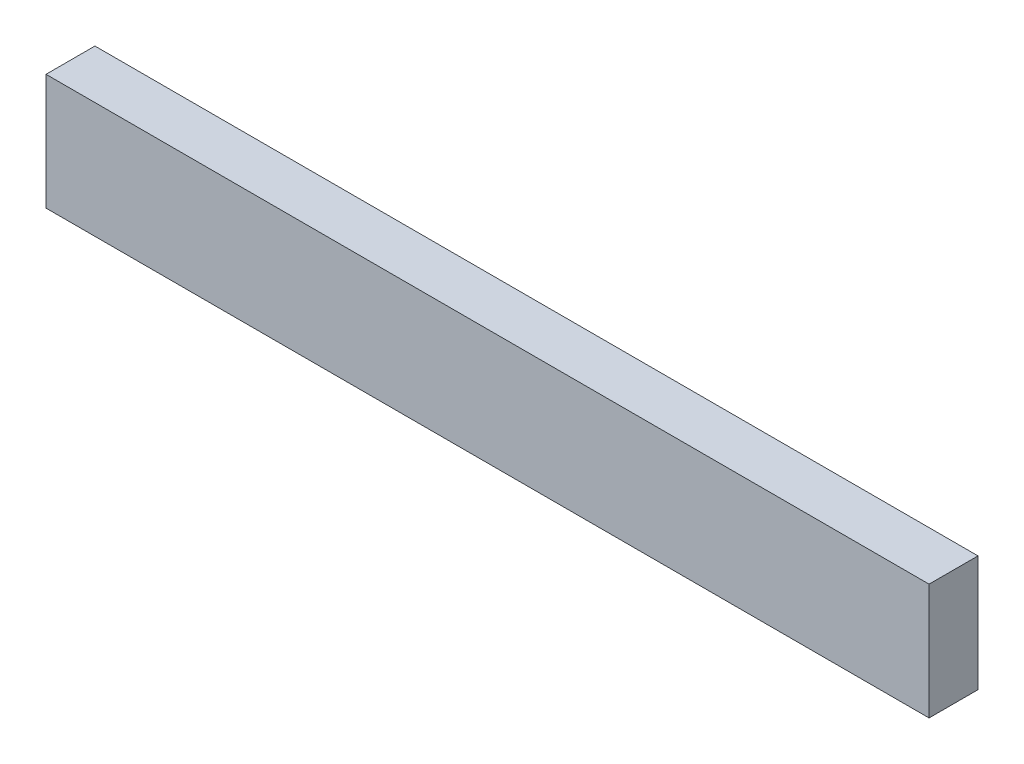
ISO-10303-21;
HEADER;
FILE_DESCRIPTION(('STEP AP214'),'2;1');
FILE_NAME('part.step','',(''),(''),'','','');
FILE_SCHEMA(('AUTOMOTIVE_DESIGN { 1 0 10303 214 1 1 1 1 }'));
ENDSEC;
DATA;
#1=APPLICATION_CONTEXT('core data for automotive mechanical design processes');
#2=APPLICATION_PROTOCOL_DEFINITION('international standard','automotive_design',2000,#1);
#3=PRODUCT_CONTEXT('',#1,'mechanical');
#4=PRODUCT('Part','Part','',(#3));
#5=PRODUCT_RELATED_PRODUCT_CATEGORY('part','',(#4));
#6=PRODUCT_DEFINITION_FORMATION('','',#4);
#7=PRODUCT_DEFINITION_CONTEXT('part definition',#1,'design');
#8=PRODUCT_DEFINITION('design','',#6,#7);
#9=PRODUCT_DEFINITION_SHAPE('','',#8);
#10=(LENGTH_UNIT() NAMED_UNIT(*) SI_UNIT(.MILLI.,.METRE.));
#11=(NAMED_UNIT(*) PLANE_ANGLE_UNIT() SI_UNIT($,.RADIAN.));
#12=(NAMED_UNIT(*) SI_UNIT($,.STERADIAN.) SOLID_ANGLE_UNIT());
#13=UNCERTAINTY_MEASURE_WITH_UNIT(LENGTH_MEASURE(1.E-05),#10,'distance_accuracy_value','');
#14=(GEOMETRIC_REPRESENTATION_CONTEXT(3) GLOBAL_UNCERTAINTY_ASSIGNED_CONTEXT((#13)) GLOBAL_UNIT_ASSIGNED_CONTEXT((#10,
#11,#12)) REPRESENTATION_CONTEXT('',''));
#15=CARTESIAN_POINT('',(0.,0.,0.));
#16=DIRECTION('',(0.,0.,1.));
#17=DIRECTION('',(1.,0.,0.));
#18=AXIS2_PLACEMENT_3D('',#15,#16,#17);
#19=CARTESIAN_POINT('',(0.,45.,-9.5));
#20=DIRECTION('',(1.,0.,0.));
#21=DIRECTION('',(0.,0.,-1.));
#22=AXIS2_PLACEMENT_3D('',#19,#20,#21);
#23=PLANE('',#22);
#24=DIRECTION('',(0.,0.,1.));
#25=VECTOR('',#24,1.);
#26=CARTESIAN_POINT('',(0.,0.,-9.5));
#27=LINE('',#26,#25);
#28=CARTESIAN_POINT('',(0.,0.,-9.5));
#29=VERTEX_POINT('',#28);
#30=CARTESIAN_POINT('',(0.,0.,9.5));
#31=VERTEX_POINT('',#30);
#32=EDGE_CURVE('E96',#29,#31,#27,.T.);
#33=ORIENTED_EDGE('',*,*,#32,.T.);
#34=DIRECTION('',(0.,-1.,0.));
#35=VECTOR('',#34,1.);
#36=CARTESIAN_POINT('',(0.,45.,9.5));
#37=LINE('',#36,#35);
#38=CARTESIAN_POINT('',(0.,45.,9.5));
#39=VERTEX_POINT('',#38);
#40=EDGE_CURVE('E11',#39,#31,#37,.T.);
#41=ORIENTED_EDGE('',*,*,#40,.F.);
#42=DIRECTION('',(0.,0.,1.));
#43=VECTOR('',#42,1.);
#44=CARTESIAN_POINT('',(0.,45.,-9.5));
#45=LINE('',#44,#43);
#46=CARTESIAN_POINT('',(0.,45.,-9.5));
#47=VERTEX_POINT('',#46);
#48=EDGE_CURVE('E84',#47,#39,#45,.T.);
#49=ORIENTED_EDGE('',*,*,#48,.F.);
#50=DIRECTION('',(0.,-1.,0.));
#51=VECTOR('',#50,1.);
#52=CARTESIAN_POINT('',(0.,45.,-9.5));
#53=LINE('',#52,#51);
#54=EDGE_CURVE('E92',#47,#29,#53,.T.);
#55=ORIENTED_EDGE('',*,*,#54,.T.);
#56=EDGE_LOOP('',(#33,#41,#49,#55));
#57=FACE_BOUND('',#56,.T.);
#58=ADVANCED_FACE('F33',(#57),#23,.F.);
#59=CARTESIAN_POINT('',(342.850000000001,45.,9.49999999999996));
#60=DIRECTION('',(0.,0.,-1.));
#61=DIRECTION('',(-1.,0.,0.));
#62=AXIS2_PLACEMENT_3D('',#59,#60,#61);
#63=PLANE('',#62);
#64=DIRECTION('',(1.,0.,0.));
#65=VECTOR('',#64,1.);
#66=CARTESIAN_POINT('',(342.850000000001,0.,9.49999999999996));
#67=LINE('',#66,#65);
#68=CARTESIAN_POINT('',(342.850000000001,0.,9.49999999999996));
#69=VERTEX_POINT('',#68);
#70=EDGE_CURVE('E88',#31,#69,#67,.T.);
#71=ORIENTED_EDGE('',*,*,#70,.T.);
#72=DIRECTION('',(0.,-1.,0.));
#73=VECTOR('',#72,1.);
#74=CARTESIAN_POINT('',(342.850000000001,45.,9.49999999999996));
#75=LINE('',#74,#73);
#76=CARTESIAN_POINT('',(342.850000000001,45.,9.49999999999996));
#77=VERTEX_POINT('',#76);
#78=EDGE_CURVE('E41',#77,#69,#75,.T.);
#79=ORIENTED_EDGE('',*,*,#78,.F.);
#80=DIRECTION('',(1.,0.,0.));
#81=VECTOR('',#80,1.);
#82=CARTESIAN_POINT('',(342.850000000001,45.,9.49999999999996));
#83=LINE('',#82,#81);
#84=EDGE_CURVE('E79',#39,#77,#83,.T.);
#85=ORIENTED_EDGE('',*,*,#84,.F.);
#86=ORIENTED_EDGE('',*,*,#40,.T.);
#87=EDGE_LOOP('',(#71,#79,#85,#86));
#88=FACE_BOUND('',#87,.T.);
#89=ADVANCED_FACE('F87',(#88),#63,.F.);
#90=CARTESIAN_POINT('',(342.850000000001,45.,-9.49999999999996));
#91=DIRECTION('',(-1.,0.,0.));
#92=DIRECTION('',(0.,0.,1.));
#93=AXIS2_PLACEMENT_3D('',#90,#91,#92);
#94=PLANE('',#93);
#95=DIRECTION('',(0.,0.,-1.));
#96=VECTOR('',#95,1.);
#97=CARTESIAN_POINT('',(342.850000000001,0.,-9.49999999999996));
#98=LINE('',#97,#96);
#99=CARTESIAN_POINT('',(342.850000000001,0.,-9.49999999999996));
#100=VERTEX_POINT('',#99);
#101=EDGE_CURVE('E66',#69,#100,#98,.T.);
#102=ORIENTED_EDGE('',*,*,#101,.T.);
#103=DIRECTION('',(0.,-1.,0.));
#104=VECTOR('',#103,1.);
#105=CARTESIAN_POINT('',(342.850000000001,45.,-9.49999999999996));
#106=LINE('',#105,#104);
#107=CARTESIAN_POINT('',(342.850000000001,45.,-9.49999999999996));
#108=VERTEX_POINT('',#107);
#109=EDGE_CURVE('E89',#108,#100,#106,.T.);
#110=ORIENTED_EDGE('',*,*,#109,.F.);
#111=DIRECTION('',(0.,0.,-1.));
#112=VECTOR('',#111,1.);
#113=CARTESIAN_POINT('',(342.850000000001,45.,-9.49999999999996));
#114=LINE('',#113,#112);
#115=EDGE_CURVE('E82',#77,#108,#114,.T.);
#116=ORIENTED_EDGE('',*,*,#115,.F.);
#117=ORIENTED_EDGE('',*,*,#78,.T.);
#118=EDGE_LOOP('',(#102,#110,#116,#117));
#119=FACE_BOUND('',#118,.T.);
#120=ADVANCED_FACE('F90',(#119),#94,.F.);
#121=CARTESIAN_POINT('',(342.850000000001,45.,-9.49999999999996));
#122=DIRECTION('',(0.,0.,1.));
#123=DIRECTION('',(1.,0.,0.));
#124=AXIS2_PLACEMENT_3D('',#121,#122,#123);
#125=PLANE('',#124);
#126=DIRECTION('',(-1.,0.,0.));
#127=VECTOR('',#126,1.);
#128=CARTESIAN_POINT('',(342.850000000001,0.,-9.49999999999996));
#129=LINE('',#128,#127);
#130=EDGE_CURVE('E72',#100,#29,#129,.T.);
#131=ORIENTED_EDGE('',*,*,#130,.T.);
#132=ORIENTED_EDGE('',*,*,#54,.F.);
#133=DIRECTION('',(-1.,0.,0.));
#134=VECTOR('',#133,1.);
#135=CARTESIAN_POINT('',(342.850000000001,45.,-9.49999999999996));
#136=LINE('',#135,#134);
#137=EDGE_CURVE('E49',#108,#47,#136,.T.);
#138=ORIENTED_EDGE('',*,*,#137,.F.);
#139=ORIENTED_EDGE('',*,*,#109,.T.);
#140=EDGE_LOOP('',(#131,#132,#138,#139));
#141=FACE_BOUND('',#140,.T.);
#142=ADVANCED_FACE('F103',(#141),#125,.F.);
#143=CARTESIAN_POINT('',(0.,45.,0.));
#144=DIRECTION('',(0.,-1.,0.));
#145=DIRECTION('',(0.,0.,-1.));
#146=AXIS2_PLACEMENT_3D('',#143,#144,#145);
#147=PLANE('',#146);
#148=ORIENTED_EDGE('',*,*,#48,.T.);
#149=ORIENTED_EDGE('',*,*,#84,.T.);
#150=ORIENTED_EDGE('',*,*,#115,.T.);
#151=ORIENTED_EDGE('',*,*,#137,.T.);
#152=EDGE_LOOP('',(#148,#149,#150,#151));
#153=FACE_BOUND('',#152,.T.);
#154=ADVANCED_FACE('F80',(#153),#147,.F.);
#155=CARTESIAN_POINT('',(0.,0.,0.));
#156=DIRECTION('',(0.,-1.,0.));
#157=DIRECTION('',(0.,0.,-1.));
#158=AXIS2_PLACEMENT_3D('',#155,#156,#157);
#159=PLANE('',#158);
#160=ORIENTED_EDGE('',*,*,#32,.F.);
#161=ORIENTED_EDGE('',*,*,#130,.F.);
#162=ORIENTED_EDGE('',*,*,#101,.F.);
#163=ORIENTED_EDGE('',*,*,#70,.F.);
#164=EDGE_LOOP('',(#160,#161,#162,#163));
#165=FACE_BOUND('',#164,.T.);
#166=ADVANCED_FACE('F106',(#165),#159,.T.);
#167=CLOSED_SHELL('',(#58,#89,#120,#142,#154,#166));
#168=MANIFOLD_SOLID_BREP('B2',#167);
#169=ADVANCED_BREP_SHAPE_REPRESENTATION('',(#18,#168),#14);
#170=SHAPE_DEFINITION_REPRESENTATION(#9,#169);
ENDSEC;
END-ISO-10303-21;
